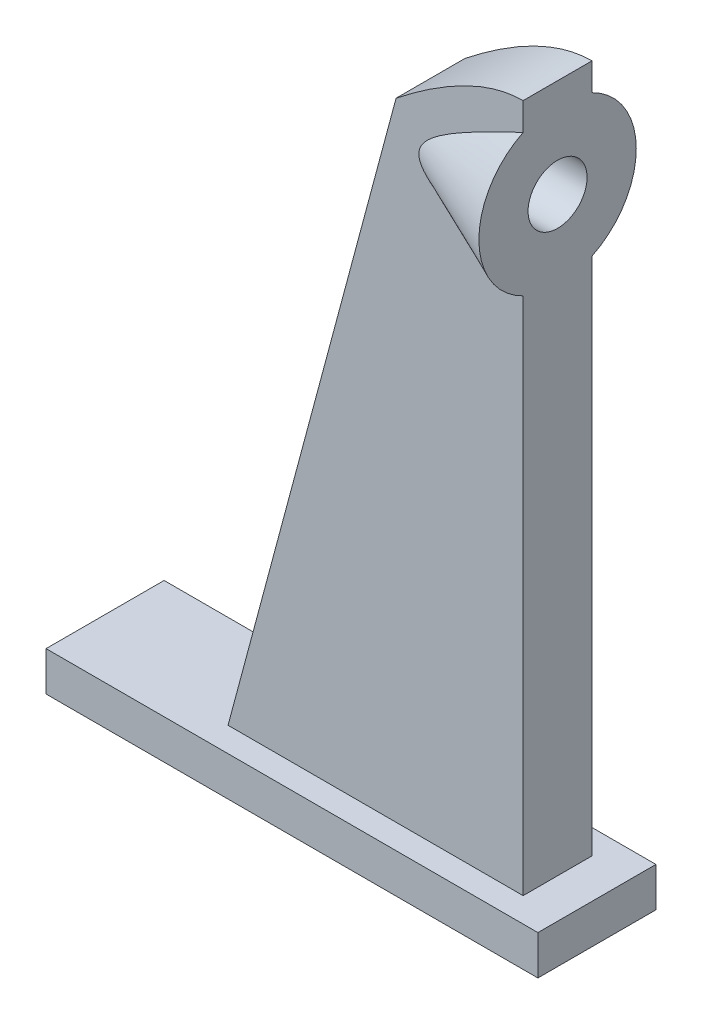
ISO-10303-21;
HEADER;
FILE_DESCRIPTION(('STEP AP214'),'2;1');
FILE_NAME('part.step','',(''),(''),'','','');
FILE_SCHEMA(('AUTOMOTIVE_DESIGN { 1 0 10303 214 1 1 1 1 }'));
ENDSEC;
DATA;
#1=APPLICATION_CONTEXT('core data for automotive mechanical design processes');
#2=APPLICATION_PROTOCOL_DEFINITION('international standard','automotive_design',2000,#1);
#3=PRODUCT_CONTEXT('',#1,'mechanical');
#4=PRODUCT('Part','Part','',(#3));
#5=PRODUCT_RELATED_PRODUCT_CATEGORY('part','',(#4));
#6=PRODUCT_DEFINITION_FORMATION('','',#4);
#7=PRODUCT_DEFINITION_CONTEXT('part definition',#1,'design');
#8=PRODUCT_DEFINITION('design','',#6,#7);
#9=PRODUCT_DEFINITION_SHAPE('','',#8);
#10=(LENGTH_UNIT() NAMED_UNIT(*) SI_UNIT(.MILLI.,.METRE.));
#11=(NAMED_UNIT(*) PLANE_ANGLE_UNIT() SI_UNIT($,.RADIAN.));
#12=(NAMED_UNIT(*) SI_UNIT($,.STERADIAN.) SOLID_ANGLE_UNIT());
#13=UNCERTAINTY_MEASURE_WITH_UNIT(LENGTH_MEASURE(1.E-05),#10,'distance_accuracy_value','');
#14=(GEOMETRIC_REPRESENTATION_CONTEXT(3) GLOBAL_UNCERTAINTY_ASSIGNED_CONTEXT((#13)) GLOBAL_UNIT_ASSIGNED_CONTEXT((#10,
#11,#12)) REPRESENTATION_CONTEXT('',''));
#15=CARTESIAN_POINT('',(0.,0.,0.));
#16=DIRECTION('',(0.,0.,1.));
#17=DIRECTION('',(1.,0.,0.));
#18=AXIS2_PLACEMENT_3D('',#15,#16,#17);
#19=CARTESIAN_POINT('',(125.,20.,30.));
#20=DIRECTION('',(-1.,0.,0.));
#21=DIRECTION('',(0.,0.,1.));
#22=AXIS2_PLACEMENT_3D('',#19,#20,#21);
#23=PLANE('',#22);
#24=DIRECTION('',(0.,0.,-1.));
#25=VECTOR('',#24,1.);
#26=CARTESIAN_POINT('',(125.,0.,30.));
#27=LINE('',#26,#25);
#28=CARTESIAN_POINT('',(125.,0.,30.));
#29=VERTEX_POINT('',#28);
#30=CARTESIAN_POINT('',(125.,0.,-30.));
#31=VERTEX_POINT('',#30);
#32=EDGE_CURVE('E169',#29,#31,#27,.T.);
#33=ORIENTED_EDGE('',*,*,#32,.T.);
#34=DIRECTION('',(0.,-1.,0.));
#35=VECTOR('',#34,1.);
#36=CARTESIAN_POINT('',(125.,20.,-30.));
#37=LINE('',#36,#35);
#38=CARTESIAN_POINT('',(125.,20.,-30.));
#39=VERTEX_POINT('',#38);
#40=EDGE_CURVE('E41',#39,#31,#37,.T.);
#41=ORIENTED_EDGE('',*,*,#40,.F.);
#42=DIRECTION('',(0.,0.,-1.));
#43=VECTOR('',#42,1.);
#44=CARTESIAN_POINT('',(125.,20.,30.));
#45=LINE('',#44,#43);
#46=CARTESIAN_POINT('',(125.,20.,30.));
#47=VERTEX_POINT('',#46);
#48=EDGE_CURVE('E164',#47,#39,#45,.T.);
#49=ORIENTED_EDGE('',*,*,#48,.F.);
#50=DIRECTION('',(0.,-1.,0.));
#51=VECTOR('',#50,1.);
#52=CARTESIAN_POINT('',(125.,20.,30.));
#53=LINE('',#52,#51);
#54=EDGE_CURVE('E158',#47,#29,#53,.T.);
#55=ORIENTED_EDGE('',*,*,#54,.T.);
#56=EDGE_LOOP('',(#33,#41,#49,#55));
#57=FACE_BOUND('',#56,.T.);
#58=ADVANCED_FACE('F33',(#57),#23,.F.);
#59=CARTESIAN_POINT('',(-125.,20.,-30.));
#60=DIRECTION('',(0.,0.,1.));
#61=DIRECTION('',(1.,0.,0.));
#62=AXIS2_PLACEMENT_3D('',#59,#60,#61);
#63=PLANE('',#62);
#64=DIRECTION('',(-1.,0.,0.));
#65=VECTOR('',#64,1.);
#66=CARTESIAN_POINT('',(-125.,0.,-30.));
#67=LINE('',#66,#65);
#68=CARTESIAN_POINT('',(-125.,0.,-30.));
#69=VERTEX_POINT('',#68);
#70=EDGE_CURVE('E167',#31,#69,#67,.T.);
#71=ORIENTED_EDGE('',*,*,#70,.T.);
#72=DIRECTION('',(0.,-1.,0.));
#73=VECTOR('',#72,1.);
#74=CARTESIAN_POINT('',(-125.,20.,-30.));
#75=LINE('',#74,#73);
#76=CARTESIAN_POINT('',(-125.,20.,-30.));
#77=VERTEX_POINT('',#76);
#78=EDGE_CURVE('E152',#77,#69,#75,.T.);
#79=ORIENTED_EDGE('',*,*,#78,.F.);
#80=DIRECTION('',(-1.,0.,0.));
#81=VECTOR('',#80,1.);
#82=CARTESIAN_POINT('',(-125.,20.,-30.));
#83=LINE('',#82,#81);
#84=EDGE_CURVE('E176',#39,#77,#83,.T.);
#85=ORIENTED_EDGE('',*,*,#84,.F.);
#86=ORIENTED_EDGE('',*,*,#40,.T.);
#87=EDGE_LOOP('',(#71,#79,#85,#86));
#88=FACE_BOUND('',#87,.T.);
#89=ADVANCED_FACE('F226',(#88),#63,.F.);
#90=CARTESIAN_POINT('',(-125.,20.,30.));
#91=DIRECTION('',(1.,0.,0.));
#92=DIRECTION('',(0.,0.,-1.));
#93=AXIS2_PLACEMENT_3D('',#90,#91,#92);
#94=PLANE('',#93);
#95=DIRECTION('',(0.,0.,1.));
#96=VECTOR('',#95,1.);
#97=CARTESIAN_POINT('',(-125.,0.,30.));
#98=LINE('',#97,#96);
#99=CARTESIAN_POINT('',(-125.,0.,30.));
#100=VERTEX_POINT('',#99);
#101=EDGE_CURVE('E165',#69,#100,#98,.T.);
#102=ORIENTED_EDGE('',*,*,#101,.T.);
#103=DIRECTION('',(0.,-1.,0.));
#104=VECTOR('',#103,1.);
#105=CARTESIAN_POINT('',(-125.,20.,30.));
#106=LINE('',#105,#104);
#107=CARTESIAN_POINT('',(-125.,20.,30.));
#108=VERTEX_POINT('',#107);
#109=EDGE_CURVE('E155',#108,#100,#106,.T.);
#110=ORIENTED_EDGE('',*,*,#109,.F.);
#111=DIRECTION('',(0.,0.,1.));
#112=VECTOR('',#111,1.);
#113=CARTESIAN_POINT('',(-125.,20.,30.));
#114=LINE('',#113,#112);
#115=EDGE_CURVE('E174',#77,#108,#114,.T.);
#116=ORIENTED_EDGE('',*,*,#115,.F.);
#117=ORIENTED_EDGE('',*,*,#78,.T.);
#118=EDGE_LOOP('',(#102,#110,#116,#117));
#119=FACE_BOUND('',#118,.T.);
#120=ADVANCED_FACE('F223',(#119),#94,.F.);
#121=CARTESIAN_POINT('',(-125.,20.,30.));
#122=DIRECTION('',(0.,0.,-1.));
#123=DIRECTION('',(-1.,0.,0.));
#124=AXIS2_PLACEMENT_3D('',#121,#122,#123);
#125=PLANE('',#124);
#126=DIRECTION('',(1.,0.,0.));
#127=VECTOR('',#126,1.);
#128=CARTESIAN_POINT('',(-125.,0.,30.));
#129=LINE('',#128,#127);
#130=EDGE_CURVE('E162',#100,#29,#129,.T.);
#131=ORIENTED_EDGE('',*,*,#130,.T.);
#132=ORIENTED_EDGE('',*,*,#54,.F.);
#133=DIRECTION('',(1.,0.,0.));
#134=VECTOR('',#133,1.);
#135=CARTESIAN_POINT('',(-125.,20.,30.));
#136=LINE('',#135,#134);
#137=EDGE_CURVE('E161',#108,#47,#136,.T.);
#138=ORIENTED_EDGE('',*,*,#137,.F.);
#139=ORIENTED_EDGE('',*,*,#109,.T.);
#140=EDGE_LOOP('',(#131,#132,#138,#139));
#141=FACE_BOUND('',#140,.T.);
#142=ADVANCED_FACE('F216',(#141),#125,.F.);
#143=CARTESIAN_POINT('',(0.,20.,0.));
#144=DIRECTION('',(0.,-1.,0.));
#145=DIRECTION('',(0.,0.,-1.));
#146=AXIS2_PLACEMENT_3D('',#143,#144,#145);
#147=PLANE('',#146);
#148=DIRECTION('',(1.,0.,0.));
#149=VECTOR('',#148,1.);
#150=CARTESIAN_POINT('',(105.,20.,-17.5));
#151=LINE('',#150,#149);
#152=CARTESIAN_POINT('',(-45.,20.,-17.5));
#153=VERTEX_POINT('',#152);
#154=CARTESIAN_POINT('',(105.,20.,-17.5));
#155=VERTEX_POINT('',#154);
#156=EDGE_CURVE('E182',#153,#155,#151,.T.);
#157=ORIENTED_EDGE('',*,*,#156,.T.);
#158=DIRECTION('',(0.,0.,1.));
#159=VECTOR('',#158,1.);
#160=CARTESIAN_POINT('',(105.,20.,-17.5));
#161=LINE('',#160,#159);
#162=CARTESIAN_POINT('',(105.,20.,17.5));
#163=VERTEX_POINT('',#162);
#164=EDGE_CURVE('E172',#155,#163,#161,.T.);
#165=ORIENTED_EDGE('',*,*,#164,.T.);
#166=DIRECTION('',(1.,0.,0.));
#167=VECTOR('',#166,1.);
#168=CARTESIAN_POINT('',(105.,20.,17.5));
#169=LINE('',#168,#167);
#170=CARTESIAN_POINT('',(-45.,20.,17.5));
#171=VERTEX_POINT('',#170);
#172=EDGE_CURVE('E350',#171,#163,#169,.T.);
#173=ORIENTED_EDGE('',*,*,#172,.F.);
#174=DIRECTION('',(0.,0.,1.));
#175=VECTOR('',#174,1.);
#176=CARTESIAN_POINT('',(-45.,20.,-17.5));
#177=LINE('',#176,#175);
#178=EDGE_CURVE('E184',#153,#171,#177,.T.);
#179=ORIENTED_EDGE('',*,*,#178,.F.);
#180=EDGE_LOOP('',(#157,#165,#173,#179));
#181=FACE_BOUND('',#180,.T.);
#182=ORIENTED_EDGE('',*,*,#48,.T.);
#183=ORIENTED_EDGE('',*,*,#84,.T.);
#184=ORIENTED_EDGE('',*,*,#115,.T.);
#185=ORIENTED_EDGE('',*,*,#137,.T.);
#186=EDGE_LOOP('',(#182,#183,#184,#185));
#187=FACE_BOUND('',#186,.T.);
#188=ADVANCED_FACE('F213',(#181,#187),#147,.F.);
#189=CARTESIAN_POINT('',(0.,0.,0.));
#190=DIRECTION('',(0.,-1.,0.));
#191=DIRECTION('',(0.,0.,-1.));
#192=AXIS2_PLACEMENT_3D('',#189,#190,#191);
#193=PLANE('',#192);
#194=ORIENTED_EDGE('',*,*,#32,.F.);
#195=ORIENTED_EDGE('',*,*,#130,.F.);
#196=ORIENTED_EDGE('',*,*,#101,.F.);
#197=ORIENTED_EDGE('',*,*,#70,.F.);
#198=EDGE_LOOP('',(#194,#195,#196,#197));
#199=FACE_BOUND('',#198,.T.);
#200=ADVANCED_FACE('F211',(#199),#193,.T.);
#201=CARTESIAN_POINT('',(105.,20.,-17.5));
#202=DIRECTION('',(1.,0.,0.));
#203=DIRECTION('',(0.,1.,0.));
#204=AXIS2_PLACEMENT_3D('',#201,#202,#203);
#205=PLANE('',#204);
#206=CARTESIAN_POINT('',(105.,320.,0.));
#207=DIRECTION('',(1.,0.,0.));
#208=DIRECTION('',(0.,1.,0.));
#209=AXIS2_PLACEMENT_3D('',#206,#207,#208);
#210=CIRCLE('',#209,15.);
#211=CARTESIAN_POINT('',(105.,335.,0.));
#212=VERTEX_POINT('',#211);
#213=EDGE_CURVE('E126',#212,#212,#210,.T.);
#214=ORIENTED_EDGE('',*,*,#213,.F.);
#215=EDGE_LOOP('',(#214));
#216=FACE_BOUND('',#215,.T.);
#217=DIRECTION('',(0.,1.,0.));
#218=VECTOR('',#217,1.);
#219=CARTESIAN_POINT('',(105.,20.,17.5));
#220=LINE('',#219,#218);
#221=CARTESIAN_POINT('',(105.,355.968736424845,17.5));
#222=VERTEX_POINT('',#221);
#223=CARTESIAN_POINT('',(105.,370.,17.5));
#224=VERTEX_POINT('',#223);
#225=EDGE_CURVE('E109',#222,#224,#220,.T.);
#226=ORIENTED_EDGE('',*,*,#225,.F.);
#227=CARTESIAN_POINT('',(105.,320.,0.));
#228=DIRECTION('',(1.,0.,0.));
#229=DIRECTION('',(0.,1.,0.));
#230=AXIS2_PLACEMENT_3D('',#227,#228,#229);
#231=CIRCLE('',#230,40.);
#232=CARTESIAN_POINT('',(105.,284.031263575155,17.5));
#233=VERTEX_POINT('',#232);
#234=EDGE_CURVE('E112',#222,#233,#231,.T.);
#235=ORIENTED_EDGE('',*,*,#234,.T.);
#236=EDGE_CURVE('E56',#163,#233,#220,.T.);
#237=ORIENTED_EDGE('',*,*,#236,.F.);
#238=ORIENTED_EDGE('',*,*,#164,.F.);
#239=DIRECTION('',(0.,1.,0.));
#240=VECTOR('',#239,1.);
#241=CARTESIAN_POINT('',(105.,20.,-17.5));
#242=LINE('',#241,#240);
#243=CARTESIAN_POINT('',(105.,284.031263575155,-17.5));
#244=VERTEX_POINT('',#243);
#245=EDGE_CURVE('E198',#155,#244,#242,.T.);
#246=ORIENTED_EDGE('',*,*,#245,.T.);
#247=CARTESIAN_POINT('',(105.,355.968736424845,-17.5));
#248=VERTEX_POINT('',#247);
#249=EDGE_CURVE('E48',#244,#248,#231,.T.);
#250=ORIENTED_EDGE('',*,*,#249,.T.);
#251=CARTESIAN_POINT('',(105.,370.,-17.5));
#252=VERTEX_POINT('',#251);
#253=EDGE_CURVE('E354',#248,#252,#242,.T.);
#254=ORIENTED_EDGE('',*,*,#253,.T.);
#255=DIRECTION('',(0.,0.,1.));
#256=VECTOR('',#255,1.);
#257=CARTESIAN_POINT('',(105.,370.,-17.5));
#258=LINE('',#257,#256);
#259=EDGE_CURVE('E114',#252,#224,#258,.T.);
#260=ORIENTED_EDGE('',*,*,#259,.T.);
#261=EDGE_LOOP('',(#226,#235,#237,#238,#246,#250,#254,#260));
#262=FACE_BOUND('',#261,.T.);
#263=ADVANCED_FACE('F110',(#216,#262),#205,.T.);
#264=CARTESIAN_POINT('',(-45.,20.,-17.5));
#265=DIRECTION('',(-0.965925826289067,0.258819045102525,0.));
#266=DIRECTION('',(-0.258819045102525,-0.965925826289067,0.));
#267=AXIS2_PLACEMENT_3D('',#264,#265,#266);
#268=PLANE('',#267);
#269=CARTESIAN_POINT('',(35.3847577293381,320.,0.));
#270=DIRECTION('',(-0.965925826289067,0.258819045102525,0.));
#271=DIRECTION('',(0.258819045102525,0.965925826289067,0.));
#272=AXIS2_PLACEMENT_3D('',#269,#270,#271);
#273=ELLIPSE('',#272,15.5291427061513,15.);
#274=CARTESIAN_POINT('',(39.403995615805,335.,0.));
#275=VERTEX_POINT('',#274);
#276=EDGE_CURVE('E36',#275,#275,#273,.T.);
#277=ORIENTED_EDGE('',*,*,#276,.F.);
#278=EDGE_LOOP('',(#277));
#279=FACE_BOUND('',#278,.T.);
#280=ORIENTED_EDGE('',*,*,#178,.T.);
#281=DIRECTION('',(-0.258819045102525,-0.965925826289067,0.));
#282=VECTOR('',#281,1.);
#283=CARTESIAN_POINT('',(-45.,20.,17.5));
#284=LINE('',#283,#282);
#285=CARTESIAN_POINT('',(40.4102848838331,338.755522675392,17.5));
#286=VERTEX_POINT('',#285);
#287=EDGE_CURVE('E346',#286,#171,#284,.T.);
#288=ORIENTED_EDGE('',*,*,#287,.F.);
#289=DIRECTION('',(0.,0.,1.));
#290=VECTOR('',#289,1.);
#291=CARTESIAN_POINT('',(40.4102848838331,338.755522675392,-17.5));
#292=LINE('',#291,#290);
#293=CARTESIAN_POINT('',(40.4102848838331,338.755522675392,-17.5));
#294=VERTEX_POINT('',#293);
#295=EDGE_CURVE('E181',#294,#286,#292,.T.);
#296=ORIENTED_EDGE('',*,*,#295,.F.);
#297=DIRECTION('',(-0.258819045102525,-0.965925826289067,0.));
#298=VECTOR('',#297,1.);
#299=CARTESIAN_POINT('',(-45.,20.,-17.5));
#300=LINE('',#299,#298);
#301=EDGE_CURVE('E190',#294,#153,#300,.T.);
#302=ORIENTED_EDGE('',*,*,#301,.T.);
#303=EDGE_LOOP('',(#280,#288,#296,#302));
#304=FACE_BOUND('',#303,.T.);
#305=ADVANCED_FACE('F207',(#279,#304),#268,.T.);
#306=CARTESIAN_POINT('',(105.,370.,-17.5));
#307=CARTESIAN_POINT('',(80.,370.,-17.5));
#308=CARTESIAN_POINT('',(40.4102848838331,338.755522675392,-17.5));
#309=B_SPLINE_CURVE_WITH_KNOTS('',2,(#306,#307,#308),.UNSPECIFIED.,.F.,.F.,(3,3),(0.,1.),.UNSPECIFIED.);
#310=DIRECTION('',(0.,0.,1.));
#311=VECTOR('',#310,1.);
#312=SURFACE_OF_LINEAR_EXTRUSION('',#309,#311);
#313=ORIENTED_EDGE('',*,*,#295,.T.);
#314=CARTESIAN_POINT('',(105.,370.,17.5));
#315=CARTESIAN_POINT('',(80.,370.,17.5));
#316=CARTESIAN_POINT('',(40.4102848838331,338.755522675392,17.5));
#317=B_SPLINE_CURVE_WITH_KNOTS('',2,(#314,#315,#316),.UNSPECIFIED.,.F.,.F.,(3,3),(0.,1.),.UNSPECIFIED.);
#318=EDGE_CURVE('E351',#224,#286,#317,.T.);
#319=ORIENTED_EDGE('',*,*,#318,.F.);
#320=ORIENTED_EDGE('',*,*,#259,.F.);
#321=EDGE_CURVE('E192',#252,#294,#309,.T.);
#322=ORIENTED_EDGE('',*,*,#321,.T.);
#323=EDGE_LOOP('',(#313,#319,#320,#322));
#324=FACE_BOUND('',#323,.T.);
#325=ADVANCED_FACE('F204',(#324),#312,.T.);
#326=CARTESIAN_POINT('',(76.3525712209583,362.188880668848,-17.5));
#327=DIRECTION('',(0.,0.,1.));
#328=DIRECTION('',(1.,0.,0.));
#329=AXIS2_PLACEMENT_3D('',#326,#327,#328);
#330=PLANE('',#329);
#331=ORIENTED_EDGE('',*,*,#253,.F.);
#332=CARTESIAN_POINT('',(218.137284989848,406.266806739352,-17.5));
#333=CARTESIAN_POINT('',(215.77531891875,405.243787461237,-17.5));
#334=CARTESIAN_POINT('',(213.413612892099,404.220167850385,-17.5));
#335=CARTESIAN_POINT('',(208.690786551047,402.171577490282,-17.5));
#336=CARTESIAN_POINT('',(206.329666236725,401.146606740849,-17.5));
#337=CARTESIAN_POINT('',(199.247250114454,398.06942809133,-17.5));
#338=CARTESIAN_POINT('',(194.526932286778,396.01496814714,-17.5));
#339=CARTESIAN_POINT('',(185.084020425572,391.896004149664,-17.5));
#340=CARTESIAN_POINT('',(180.361430324995,389.83149107795,-17.5));
#341=CARTESIAN_POINT('',(170.920591293877,385.692623771745,-17.5));
#342=CARTESIAN_POINT('',(166.202342340145,383.618269590196,-17.5));
#343=CARTESIAN_POINT('',(159.01608149934,380.446920831363,-17.5));
#344=CARTESIAN_POINT('',(156.545968047058,379.354688296369,-17.5));
#345=CARTESIAN_POINT('',(151.607627891349,377.16596695099,-17.5));
#346=CARTESIAN_POINT('',(149.139401187339,376.069478141925,-17.5));
#347=CARTESIAN_POINT('',(144.205150708024,373.871438716567,-17.5));
#348=CARTESIAN_POINT('',(141.739126971641,372.769888012875,-17.5));
#349=CARTESIAN_POINT('',(136.809790101517,370.560738917928,-17.5));
#350=CARTESIAN_POINT('',(134.346476966499,369.453140529521,-17.5));
#351=CARTESIAN_POINT('',(129.425772166185,367.231778377236,-17.5));
#352=CARTESIAN_POINT('',(126.968376992194,366.118022389692,-17.5));
#353=CARTESIAN_POINT('',(122.057687016696,363.881485947814,-17.5));
#354=CARTESIAN_POINT('',(119.604392224346,362.758705473361,-17.5));
#355=CARTESIAN_POINT('',(114.703097598468,360.501886530877,-17.5));
#356=CARTESIAN_POINT('',(112.255097563291,359.367848501122,-17.5));
#357=CARTESIAN_POINT('',(107.365832705222,357.085356714139,-17.5));
#358=CARTESIAN_POINT('',(104.924567842467,355.936903042456,-17.5));
#359=CARTESIAN_POINT('',(100.630986445417,353.896655347703,-17.5));
#360=CARTESIAN_POINT('',(98.7767849393798,353.008830210211,-17.5));
#361=CARTESIAN_POINT('',(95.0749286703318,351.219342638487,-17.5));
#362=CARTESIAN_POINT('',(93.2272742743602,350.317679443122,-17.5));
#363=CARTESIAN_POINT('',(90.4602003232931,348.950866678503,-17.5));
#364=CARTESIAN_POINT('',(89.5375100763668,348.492336302878,-17.5));
#365=CARTESIAN_POINT('',(87.6946805310852,347.570180214336,-17.5));
#366=CARTESIAN_POINT('',(86.7745412251965,347.106554516487,-17.5));
#367=CARTESIAN_POINT('',(84.9373858009734,346.173520147769,-17.5));
#368=CARTESIAN_POINT('',(84.0203691980752,345.7041124317,-17.5));
#369=CARTESIAN_POINT('',(82.1898459628947,344.758501424961,-17.5));
#370=CARTESIAN_POINT('',(81.2763393217536,344.282298151457,-17.5));
#371=CARTESIAN_POINT('',(79.4655573338352,343.328278945671,-17.5));
#372=CARTESIAN_POINT('',(78.5682270143412,342.850567473535,-17.5));
#373=CARTESIAN_POINT('',(76.7784797270659,341.885991022634,-17.5));
#374=CARTESIAN_POINT('',(75.8860628152164,341.399125939946,-17.5));
#375=CARTESIAN_POINT('',(74.1066528274325,340.414131274901,-17.5));
#376=CARTESIAN_POINT('',(73.2196639047566,339.915994174234,-17.5));
#377=CARTESIAN_POINT('',(71.4532745107086,338.906487075549,-17.5));
#378=CARTESIAN_POINT('',(70.5738737868599,338.395117520086,-17.5));
#379=CARTESIAN_POINT('',(68.8279548907131,337.358015200117,-17.5));
#380=CARTESIAN_POINT('',(67.9614009790299,336.832342902584,-17.5));
#381=CARTESIAN_POINT('',(66.6709757175746,336.028572125292,-17.5));
#382=CARTESIAN_POINT('',(66.2423629542073,335.758079478604,-17.5));
#383=CARTESIAN_POINT('',(65.3888234083654,335.21134555515,-17.5));
#384=CARTESIAN_POINT('',(64.9638965628197,334.935104377024,-17.5));
#385=CARTESIAN_POINT('',(64.1188499941139,334.376424148302,-17.5));
#386=CARTESIAN_POINT('',(63.6987251987898,334.093992780404,-17.5));
#387=CARTESIAN_POINT('',(62.8635816381736,333.521693035302,-17.5));
#388=CARTESIAN_POINT('',(62.4485627031184,333.231824906354,-17.5));
#389=CARTESIAN_POINT('',(61.6247578638352,332.643603478139,-17.5));
#390=CARTESIAN_POINT('',(61.2159701430989,332.345252727292,-17.5));
#391=CARTESIAN_POINT('',(60.4058423472537,331.738630647548,-17.5));
#392=CARTESIAN_POINT('',(60.0045016343431,331.43036017447,-17.5));
#393=CARTESIAN_POINT('',(59.4176883559897,330.965798948091,-17.5));
#394=CARTESIAN_POINT('',(59.2286653275615,330.813984363857,-17.5));
#395=CARTESIAN_POINT('',(58.8529696834506,330.507454170058,-17.5));
#396=CARTESIAN_POINT('',(58.6662971667051,330.352738439055,-17.5));
#397=CARTESIAN_POINT('',(58.2955470717255,330.04013725335,-17.5));
#398=CARTESIAN_POINT('',(58.1114701033723,329.882251074133,-17.5));
#399=CARTESIAN_POINT('',(57.746290796914,329.563076104937,-17.5));
#400=CARTESIAN_POINT('',(57.5651884839244,329.401787286255,-17.5));
#401=CARTESIAN_POINT('',(57.0266470803546,328.912151742227,-17.5));
#402=CARTESIAN_POINT('',(56.6742188775535,328.578241237607,-17.5));
#403=CARTESIAN_POINT('',(55.9867662883865,327.892951346214,-17.5));
#404=CARTESIAN_POINT('',(55.651738312745,327.541575591631,-17.5));
#405=CARTESIAN_POINT('',(55.0821100132244,326.904543716155,-17.5));
#406=CARTESIAN_POINT('',(54.8426454012097,326.623252885749,-17.5));
#407=CARTESIAN_POINT('',(54.3806405089528,326.047127450251,-17.5));
#408=CARTESIAN_POINT('',(54.1580950956696,325.75229699678,-17.5));
#409=CARTESIAN_POINT('',(53.7347874719742,325.147992113835,-17.5));
#410=CARTESIAN_POINT('',(53.5339903014745,324.838542370542,-17.5));
#411=CARTESIAN_POINT('',(53.1597948707136,324.203492978277,-17.5));
#412=CARTESIAN_POINT('',(52.9863784058108,323.877904250503,-17.5));
#413=CARTESIAN_POINT('',(52.7325898968047,323.335183471271,-17.5));
#414=CARTESIAN_POINT('',(52.6416611286799,323.122975688766,-17.5));
#415=CARTESIAN_POINT('',(52.4754559338443,322.692545886516,-17.5));
#416=CARTESIAN_POINT('',(52.4001738725062,322.474326063975,-17.5));
#417=CARTESIAN_POINT('',(52.2673606061829,322.032891186534,-17.5));
#418=CARTESIAN_POINT('',(52.2098011404105,321.809684699603,-17.5));
#419=CARTESIAN_POINT('',(52.114092445955,321.359113775464,-17.5));
#420=CARTESIAN_POINT('',(52.0759428857641,321.131749409339,-17.5));
#421=CARTESIAN_POINT('',(52.0202060256523,320.672668133486,-17.5));
#422=CARTESIAN_POINT('',(52.0027831512301,320.440931042825,-17.5));
#423=CARTESIAN_POINT('',(51.9897342579832,319.976846346654,-17.5));
#424=CARTESIAN_POINT('',(51.9941075128519,319.744498761745,-17.5));
#425=CARTESIAN_POINT('',(52.024487487381,319.281044793087,-17.5));
#426=CARTESIAN_POINT('',(52.0505117885889,319.049939571742,-17.5));
#427=CARTESIAN_POINT('',(52.1232134433659,318.591012118103,-17.5));
#428=CARTESIAN_POINT('',(52.1698934788905,318.363190316099,-17.5));
#429=CARTESIAN_POINT('',(52.2926045766029,317.870954837914,-17.5));
#430=CARTESIAN_POINT('',(52.3724485576779,317.60749331694,-17.5));
#431=CARTESIAN_POINT('',(52.5554953163052,317.088854454016,-17.5));
#432=CARTESIAN_POINT('',(52.6587039404186,316.833679203855,-17.5));
#433=CARTESIAN_POINT('',(52.8852169218319,316.331944099257,-17.5));
#434=CARTESIAN_POINT('',(53.0085563517592,316.085400209841,-17.5));
#435=CARTESIAN_POINT('',(53.2719889865955,315.601516923066,-17.5));
#436=CARTESIAN_POINT('',(53.4120825234007,315.364177708174,-17.5));
#437=CARTESIAN_POINT('',(53.8313195272822,314.700197810449,-17.5));
#438=CARTESIAN_POINT('',(54.1273879932194,314.284236197092,-17.5));
#439=CARTESIAN_POINT('',(54.7536357012697,313.478768441096,-17.5));
#440=CARTESIAN_POINT('',(55.0838480234871,313.089288572167,-17.5));
#441=CARTESIAN_POINT('',(55.5982345025286,312.521444366261,-17.5));
#442=CARTESIAN_POINT('',(55.7731813180082,312.334595441934,-17.5));
#443=CARTESIAN_POINT('',(56.1284748844592,311.966092772631,-17.5));
#444=CARTESIAN_POINT('',(56.3088216993681,311.784439089217,-17.5));
#445=CARTESIAN_POINT('',(56.6740675685319,311.425983853329,-17.5));
#446=CARTESIAN_POINT('',(56.858964080221,311.249179702532,-17.5));
#447=CARTESIAN_POINT('',(57.2328037279597,310.899919610963,-17.5));
#448=CARTESIAN_POINT('',(57.4217467884472,310.727463589129,-17.5));
#449=CARTESIAN_POINT('',(58.0067961080155,310.20449476356,-17.5));
#450=CARTESIAN_POINT('',(58.4087056407445,309.860460878029,-17.5));
#451=CARTESIAN_POINT('',(59.2242406788103,309.186519666755,-17.5));
#452=CARTESIAN_POINT('',(59.6378684001983,308.856615043058,-17.5));
#453=CARTESIAN_POINT('',(60.4746546878632,308.208553030884,-17.5));
#454=CARTESIAN_POINT('',(60.8978195862438,307.890403840741,-17.5));
#455=CARTESIAN_POINT('',(61.7515840310747,307.264333706491,-17.5));
#456=CARTESIAN_POINT('',(62.1821831021468,306.956412112035,-17.5));
#457=CARTESIAN_POINT('',(63.0506292121239,306.348548333473,-17.5));
#458=CARTESIAN_POINT('',(63.4884921566121,306.048628923321,-17.5));
#459=CARTESIAN_POINT('',(64.3693441599068,305.456416616102,-17.5));
#460=CARTESIAN_POINT('',(64.8123332882111,305.164123822609,-17.5));
#461=CARTESIAN_POINT('',(65.7024615011639,304.586300433795,-17.5));
#462=CARTESIAN_POINT('',(66.1495989937648,304.300767382445,-17.5));
#463=CARTESIAN_POINT('',(67.0475569236254,303.735546528732,-17.5));
#464=CARTESIAN_POINT('',(67.4983774200536,303.455858820536,-17.5));
#465=CARTESIAN_POINT('',(68.8600852388693,302.621753453715,-17.5));
#466=CARTESIAN_POINT('',(69.775769508022,302.075160606814,-17.5));
#467=CARTESIAN_POINT('',(71.6168166223736,300.998443208279,-17.5));
#468=CARTESIAN_POINT('',(72.5421802122431,300.468319936361,-17.5));
#469=CARTESIAN_POINT('',(74.3989008467952,299.42232349606,-17.5));
#470=CARTESIAN_POINT('',(75.3302454481367,298.906428210158,-17.5));
#471=CARTESIAN_POINT('',(76.7317411954011,298.140848356751,-17.5));
#472=CARTESIAN_POINT('',(77.1996458233768,297.887036019661,-17.5));
#473=CARTESIAN_POINT('',(78.1368124534571,297.381928988933,-17.5));
#474=CARTESIAN_POINT('',(78.6060744556007,297.130634295368,-17.5));
#475=CARTESIAN_POINT('',(80.0026324547129,296.387151890463,-17.5));
#476=CARTESIAN_POINT('',(80.9316967932966,295.898284148043,-17.5));
#477=CARTESIAN_POINT('',(82.7937712760071,294.928114352928,-17.5));
#478=CARTESIAN_POINT('',(83.7267814556398,294.446812368496,-17.5));
#479=CARTESIAN_POINT('',(85.5961429671902,293.4906742535,-17.5));
#480=CARTESIAN_POINT('',(86.5324944005161,293.015838321325,-17.5));
#481=CARTESIAN_POINT('',(88.4080185404379,292.071768337065,-17.5));
#482=CARTESIAN_POINT('',(89.3471912573227,291.60253430544,-17.5));
#483=CARTESIAN_POINT('',(92.1685790965401,290.20198815067,-17.5));
#484=CARTESIAN_POINT('',(94.0544113821348,289.277960588942,-17.5));
#485=CARTESIAN_POINT('',(97.8332992615528,287.444911849717,-17.5));
#486=CARTESIAN_POINT('',(99.7263547405698,286.535890434926,-17.5));
#487=CARTESIAN_POINT('',(103.519988846798,284.728840846647,-17.5));
#488=CARTESIAN_POINT('',(105.420573048345,283.830824385897,-17.5));
#489=CARTESIAN_POINT('',(109.226249829971,282.044388386064,-17.5));
#490=CARTESIAN_POINT('',(111.131342425692,281.155968880336,-17.5));
#491=CARTESIAN_POINT('',(114.945026046972,279.387065852804,-17.5));
#492=CARTESIAN_POINT('',(116.853616789064,278.506581719455,-17.5));
#493=CARTESIAN_POINT('',(120.6737947499,276.752147803758,-17.5));
#494=CARTESIAN_POINT('',(122.585381965045,275.878198013568,-17.5));
#495=CARTESIAN_POINT('',(126.402705559596,274.139589985413,-17.5));
#496=CARTESIAN_POINT('',(128.308431055333,273.274907841283,-17.5));
#497=CARTESIAN_POINT('',(132.121974719217,271.550171564231,-17.5));
#498=CARTESIAN_POINT('',(134.029792887792,270.690117432255,-17.5));
#499=CARTESIAN_POINT('',(139.755976585896,268.115843025897,-17.5));
#500=CARTESIAN_POINT('',(143.577003215715,266.40754169176,-17.5));
#501=CARTESIAN_POINT('',(151.222903436829,263.003405626014,-17.5));
#502=CARTESIAN_POINT('',(155.047775078606,261.307566510521,-17.5));
#503=CARTESIAN_POINT('',(162.701564369807,257.925040297148,-17.5));
#504=CARTESIAN_POINT('',(166.530482021786,256.238353205053,-17.5));
#505=CARTESIAN_POINT('',(174.332482870827,252.810245545495,-17.5));
#506=CARTESIAN_POINT('',(178.305684907752,251.069095559636,-17.5));
#507=CARTESIAN_POINT('',(186.255157351932,247.592826216508,-17.5));
#508=CARTESIAN_POINT('',(190.231428006076,245.857707423985,-17.5));
#509=CARTESIAN_POINT('',(198.195118588144,242.388569565028,-17.5));
#510=CARTESIAN_POINT('',(202.18254343838,240.654561801424,-17.5));
#511=CARTESIAN_POINT('',(210.158834841745,237.19088109936,-17.5));
#512=CARTESIAN_POINT('',(214.147701226309,235.461207772758,-17.5));
#513=CARTESIAN_POINT('',(218.137284989848,233.733193260648,-17.5));
#514=B_SPLINE_CURVE_WITH_KNOTS('',3,(#332,#333,#334,#335,#336,#337,#338,#339,#340,#341,#342,
#343,#344,#345,#346,#347,#348,#349,#350,#351,#352,#353,#354,#355,#356,#357,#358,#359,#360,#361,
#362,#363,#364,#365,#366,#367,#368,#369,#370,#371,#372,#373,#374,#375,#376,#377,#378,#379,#380,
#381,#382,#383,#384,#385,#386,#387,#388,#389,#390,#391,#392,#393,#394,#395,#396,#397,#398,#399,
#400,#401,#402,#403,#404,#405,#406,#407,#408,#409,#410,#411,#412,#413,#414,#415,#416,#417,#418,
#419,#420,#421,#422,#423,#424,#425,#426,#427,#428,#429,#430,#431,#432,#433,#434,#435,#436,#437,
#438,#439,#440,#441,#442,#443,#444,#445,#446,#447,#448,#449,#450,#451,#452,#453,#454,#455,#456,
#457,#458,#459,#460,#461,#462,#463,#464,#465,#466,#467,#468,#469,#470,#471,#472,#473,#474,#475,
#476,#477,#478,#479,#480,#481,#482,#483,#484,#485,#486,#487,#488,#489,#490,#491,#492,#493,#494,
#495,#496,#497,#498,#499,#500,#501,#502,#503,#504,#505,#506,#507,#508,#509,#510,#511,#512,#513),
.UNSPECIFIED.,.F.,.F.,(4,2,2,2,2,2,2,2,2,2,2,2,2,2,2,2,2,2,2,2,2,2,2,2,2,2,2,2,2,2,2,2,2,2,2,2,
2,2,2,2,2,2,2,2,2,2,2,2,2,2,2,2,2,2,2,2,2,2,2,2,2,2,2,2,2,2,2,2,2,2,2,2,2,2,2,2,2,2,2,2,2,2,2,2,
2,2,2,2,2,2,4),(0.,7.72198592502717,15.443972894601,30.8880552364388,46.350442051366,
61.8127457794625,69.9152046855805,78.0176610806335,86.1202579025671,94.2228509089195,
102.316858459743,110.410884060098,118.504595772893,126.598259478286,132.765606880911,
138.933294729191,142.024312243962,145.115320620849,148.205825238489,151.296322050838,
154.345980882493,157.39567435847,160.447465674819,163.499155056628,166.539498990786,
168.059947955243,169.580370851232,171.099003073404,172.6175846659,174.135714756023,
175.653714219569,176.381012184594,177.108340661269,177.835837283512,178.56334004496,
180.019304666194,181.474967752014,182.582708161824,183.69011114682,184.795706711667,
185.900564074057,186.592654934041,187.284496127639,187.975228315218,188.665948705169,
189.36211282081,190.058253738517,190.754960503912,191.451757756772,192.276350459619,
193.101149729751,193.927401642926,194.753669926738,196.282681650068,197.813188881381,
198.580998499296,199.348817211899,200.116216165406,200.88360080159,202.470294421353,
204.057290133869,205.645372506398,207.233353702382,208.825454687001,210.41757728172,
212.009112242392,213.60067282199,216.799669174615,219.998913476517,223.192866710676,
224.789795127414,226.386723590071,229.536181015204,232.685666840703,235.835249081234,
238.984842821819,245.284880440936,251.584818340297,257.890962880326,264.197129330544,
270.502805561628,276.808474223452,283.086618254068,289.364763567271,301.921278580423,
314.473141959047,327.025013272952,340.038900918166,353.0539759869,366.098399793901,
379.141610465791),.UNSPECIFIED.);
#515=EDGE_CURVE('E117',#248,#244,#514,.T.);
#516=ORIENTED_EDGE('',*,*,#515,.T.);
#517=ORIENTED_EDGE('',*,*,#245,.F.);
#518=ORIENTED_EDGE('',*,*,#156,.F.);
#519=ORIENTED_EDGE('',*,*,#301,.F.);
#520=ORIENTED_EDGE('',*,*,#321,.F.);
#521=EDGE_LOOP('',(#331,#516,#517,#518,#519,#520));
#522=FACE_BOUND('',#521,.T.);
#523=ADVANCED_FACE('F134',(#522),#330,.F.);
#524=CARTESIAN_POINT('',(76.3525712209583,362.188880668848,17.5));
#525=DIRECTION('',(0.,0.,1.));
#526=DIRECTION('',(1.,0.,0.));
#527=AXIS2_PLACEMENT_3D('',#524,#525,#526);
#528=PLANE('',#527);
#529=CARTESIAN_POINT('',(218.137284989848,406.266806739352,17.5));
#530=CARTESIAN_POINT('',(215.77531891875,405.243787461237,17.5));
#531=CARTESIAN_POINT('',(213.413612892099,404.220167850385,17.5));
#532=CARTESIAN_POINT('',(208.690786551047,402.171577490282,17.5));
#533=CARTESIAN_POINT('',(206.329666236725,401.146606740849,17.5));
#534=CARTESIAN_POINT('',(199.247250114454,398.06942809133,17.5));
#535=CARTESIAN_POINT('',(194.526932286778,396.01496814714,17.5));
#536=CARTESIAN_POINT('',(185.084020425572,391.896004149664,17.5));
#537=CARTESIAN_POINT('',(180.361430324995,389.83149107795,17.5));
#538=CARTESIAN_POINT('',(170.920591293877,385.692623771745,17.5));
#539=CARTESIAN_POINT('',(166.202342340145,383.618269590196,17.5));
#540=CARTESIAN_POINT('',(159.01608149934,380.446920831363,17.5));
#541=CARTESIAN_POINT('',(156.545968047058,379.354688296369,17.5));
#542=CARTESIAN_POINT('',(151.607627891349,377.16596695099,17.5));
#543=CARTESIAN_POINT('',(149.139401187339,376.069478141925,17.5));
#544=CARTESIAN_POINT('',(144.205150708024,373.871438716567,17.5));
#545=CARTESIAN_POINT('',(141.739126971641,372.769888012875,17.5));
#546=CARTESIAN_POINT('',(136.809790101517,370.560738917928,17.5));
#547=CARTESIAN_POINT('',(134.346476966499,369.453140529521,17.5));
#548=CARTESIAN_POINT('',(129.425772166185,367.231778377236,17.5));
#549=CARTESIAN_POINT('',(126.968376992194,366.118022389692,17.5));
#550=CARTESIAN_POINT('',(122.057687016696,363.881485947814,17.5));
#551=CARTESIAN_POINT('',(119.604392224346,362.758705473361,17.5));
#552=CARTESIAN_POINT('',(114.703097598468,360.501886530877,17.5));
#553=CARTESIAN_POINT('',(112.255097563291,359.367848501122,17.5));
#554=CARTESIAN_POINT('',(107.365832705222,357.085356714139,17.5));
#555=CARTESIAN_POINT('',(104.924567842467,355.936903042456,17.5));
#556=CARTESIAN_POINT('',(100.630986445417,353.896655347703,17.5));
#557=CARTESIAN_POINT('',(98.7767849393798,353.008830210211,17.5));
#558=CARTESIAN_POINT('',(95.0749286703318,351.219342638487,17.5));
#559=CARTESIAN_POINT('',(93.2272742743602,350.317679443122,17.5));
#560=CARTESIAN_POINT('',(90.4602003232931,348.950866678503,17.5));
#561=CARTESIAN_POINT('',(89.5375100763668,348.492336302878,17.5));
#562=CARTESIAN_POINT('',(87.6946805310852,347.570180214336,17.5));
#563=CARTESIAN_POINT('',(86.7745412251965,347.106554516487,17.5));
#564=CARTESIAN_POINT('',(84.9373858009734,346.173520147769,17.5));
#565=CARTESIAN_POINT('',(84.0203691980752,345.7041124317,17.5));
#566=CARTESIAN_POINT('',(82.1898459628947,344.758501424961,17.5));
#567=CARTESIAN_POINT('',(81.2763393217536,344.282298151457,17.5));
#568=CARTESIAN_POINT('',(79.4655573338352,343.328278945671,17.5));
#569=CARTESIAN_POINT('',(78.5682270143412,342.850567473535,17.5));
#570=CARTESIAN_POINT('',(76.7784797270659,341.885991022634,17.5));
#571=CARTESIAN_POINT('',(75.8860628152164,341.399125939946,17.5));
#572=CARTESIAN_POINT('',(74.1066528274325,340.414131274901,17.5));
#573=CARTESIAN_POINT('',(73.2196639047566,339.915994174234,17.5));
#574=CARTESIAN_POINT('',(71.4532745107086,338.906487075549,17.5));
#575=CARTESIAN_POINT('',(70.5738737868599,338.395117520086,17.5));
#576=CARTESIAN_POINT('',(68.8279548907131,337.358015200117,17.5));
#577=CARTESIAN_POINT('',(67.9614009790299,336.832342902584,17.5));
#578=CARTESIAN_POINT('',(66.6709757175746,336.028572125292,17.5));
#579=CARTESIAN_POINT('',(66.2423629542073,335.758079478604,17.5));
#580=CARTESIAN_POINT('',(65.3888234083654,335.21134555515,17.5));
#581=CARTESIAN_POINT('',(64.9638965628197,334.935104377024,17.5));
#582=CARTESIAN_POINT('',(64.1188499941139,334.376424148302,17.5));
#583=CARTESIAN_POINT('',(63.6987251987898,334.093992780404,17.5));
#584=CARTESIAN_POINT('',(62.8635816381736,333.521693035302,17.5));
#585=CARTESIAN_POINT('',(62.4485627031184,333.231824906354,17.5));
#586=CARTESIAN_POINT('',(61.6247578638352,332.643603478139,17.5));
#587=CARTESIAN_POINT('',(61.2159701430989,332.345252727292,17.5));
#588=CARTESIAN_POINT('',(60.4058423472537,331.738630647548,17.5));
#589=CARTESIAN_POINT('',(60.0045016343431,331.43036017447,17.5));
#590=CARTESIAN_POINT('',(59.4176883559897,330.965798948091,17.5));
#591=CARTESIAN_POINT('',(59.2286653275615,330.813984363857,17.5));
#592=CARTESIAN_POINT('',(58.8529696834506,330.507454170058,17.5));
#593=CARTESIAN_POINT('',(58.6662971667051,330.352738439055,17.5));
#594=CARTESIAN_POINT('',(58.2955470717255,330.04013725335,17.5));
#595=CARTESIAN_POINT('',(58.1114701033723,329.882251074133,17.5));
#596=CARTESIAN_POINT('',(57.746290796914,329.563076104937,17.5));
#597=CARTESIAN_POINT('',(57.5651884839244,329.401787286255,17.5));
#598=CARTESIAN_POINT('',(57.0266470803546,328.912151742227,17.5));
#599=CARTESIAN_POINT('',(56.6742188775535,328.578241237607,17.5));
#600=CARTESIAN_POINT('',(55.9867662883865,327.892951346214,17.5));
#601=CARTESIAN_POINT('',(55.651738312745,327.541575591631,17.5));
#602=CARTESIAN_POINT('',(55.0821100132244,326.904543716155,17.5));
#603=CARTESIAN_POINT('',(54.8426454012097,326.623252885749,17.5));
#604=CARTESIAN_POINT('',(54.3806405089528,326.047127450251,17.5));
#605=CARTESIAN_POINT('',(54.1580950956696,325.75229699678,17.5));
#606=CARTESIAN_POINT('',(53.7347874719742,325.147992113835,17.5));
#607=CARTESIAN_POINT('',(53.5339903014745,324.838542370542,17.5));
#608=CARTESIAN_POINT('',(53.1597948707136,324.203492978277,17.5));
#609=CARTESIAN_POINT('',(52.9863784058108,323.877904250503,17.5));
#610=CARTESIAN_POINT('',(52.7325898968047,323.335183471271,17.5));
#611=CARTESIAN_POINT('',(52.6416611286799,323.122975688766,17.5));
#612=CARTESIAN_POINT('',(52.4754559338443,322.692545886516,17.5));
#613=CARTESIAN_POINT('',(52.4001738725062,322.474326063975,17.5));
#614=CARTESIAN_POINT('',(52.2673606061829,322.032891186534,17.5));
#615=CARTESIAN_POINT('',(52.2098011404105,321.809684699603,17.5));
#616=CARTESIAN_POINT('',(52.114092445955,321.359113775464,17.5));
#617=CARTESIAN_POINT('',(52.0759428857641,321.131749409339,17.5));
#618=CARTESIAN_POINT('',(52.0202060256523,320.672668133486,17.5));
#619=CARTESIAN_POINT('',(52.0027831512301,320.440931042825,17.5));
#620=CARTESIAN_POINT('',(51.9897342579832,319.976846346654,17.5));
#621=CARTESIAN_POINT('',(51.9941075128519,319.744498761745,17.5));
#622=CARTESIAN_POINT('',(52.024487487381,319.281044793087,17.5));
#623=CARTESIAN_POINT('',(52.0505117885889,319.049939571742,17.5));
#624=CARTESIAN_POINT('',(52.1232134433659,318.591012118103,17.5));
#625=CARTESIAN_POINT('',(52.1698934788905,318.363190316099,17.5));
#626=CARTESIAN_POINT('',(52.2926045766029,317.870954837914,17.5));
#627=CARTESIAN_POINT('',(52.3724485576779,317.60749331694,17.5));
#628=CARTESIAN_POINT('',(52.5554953163052,317.088854454016,17.5));
#629=CARTESIAN_POINT('',(52.6587039404186,316.833679203855,17.5));
#630=CARTESIAN_POINT('',(52.8852169218319,316.331944099257,17.5));
#631=CARTESIAN_POINT('',(53.0085563517592,316.085400209841,17.5));
#632=CARTESIAN_POINT('',(53.2719889865955,315.601516923066,17.5));
#633=CARTESIAN_POINT('',(53.4120825234007,315.364177708174,17.5));
#634=CARTESIAN_POINT('',(53.8313195272822,314.700197810449,17.5));
#635=CARTESIAN_POINT('',(54.1273879932194,314.284236197092,17.5));
#636=CARTESIAN_POINT('',(54.7536357012697,313.478768441096,17.5));
#637=CARTESIAN_POINT('',(55.0838480234871,313.089288572167,17.5));
#638=CARTESIAN_POINT('',(55.5982345025286,312.521444366261,17.5));
#639=CARTESIAN_POINT('',(55.7731813180082,312.334595441934,17.5));
#640=CARTESIAN_POINT('',(56.1284748844592,311.966092772631,17.5));
#641=CARTESIAN_POINT('',(56.3088216993681,311.784439089217,17.5));
#642=CARTESIAN_POINT('',(56.6740675685319,311.425983853329,17.5));
#643=CARTESIAN_POINT('',(56.858964080221,311.249179702532,17.5));
#644=CARTESIAN_POINT('',(57.2328037279597,310.899919610963,17.5));
#645=CARTESIAN_POINT('',(57.4217467884472,310.727463589129,17.5));
#646=CARTESIAN_POINT('',(58.0067961080155,310.20449476356,17.5));
#647=CARTESIAN_POINT('',(58.4087056407445,309.860460878029,17.5));
#648=CARTESIAN_POINT('',(59.2242406788103,309.186519666755,17.5));
#649=CARTESIAN_POINT('',(59.6378684001983,308.856615043058,17.5));
#650=CARTESIAN_POINT('',(60.4746546878632,308.208553030884,17.5));
#651=CARTESIAN_POINT('',(60.8978195862438,307.890403840741,17.5));
#652=CARTESIAN_POINT('',(61.7515840310747,307.264333706491,17.5));
#653=CARTESIAN_POINT('',(62.1821831021468,306.956412112035,17.5));
#654=CARTESIAN_POINT('',(63.0506292121239,306.348548333473,17.5));
#655=CARTESIAN_POINT('',(63.4884921566121,306.048628923321,17.5));
#656=CARTESIAN_POINT('',(64.3693441599068,305.456416616102,17.5));
#657=CARTESIAN_POINT('',(64.8123332882111,305.164123822609,17.5));
#658=CARTESIAN_POINT('',(65.7024615011639,304.586300433795,17.5));
#659=CARTESIAN_POINT('',(66.1495989937648,304.300767382445,17.5));
#660=CARTESIAN_POINT('',(67.0475569236254,303.735546528732,17.5));
#661=CARTESIAN_POINT('',(67.4983774200536,303.455858820536,17.5));
#662=CARTESIAN_POINT('',(68.8600852388693,302.621753453715,17.5));
#663=CARTESIAN_POINT('',(69.775769508022,302.075160606814,17.5));
#664=CARTESIAN_POINT('',(71.6168166223736,300.998443208279,17.5));
#665=CARTESIAN_POINT('',(72.5421802122431,300.468319936361,17.5));
#666=CARTESIAN_POINT('',(74.3989008467952,299.42232349606,17.5));
#667=CARTESIAN_POINT('',(75.3302454481367,298.906428210158,17.5));
#668=CARTESIAN_POINT('',(76.7317411954011,298.140848356751,17.5));
#669=CARTESIAN_POINT('',(77.1996458233768,297.887036019661,17.5));
#670=CARTESIAN_POINT('',(78.1368124534571,297.381928988933,17.5));
#671=CARTESIAN_POINT('',(78.6060744556007,297.130634295368,17.5));
#672=CARTESIAN_POINT('',(80.0026324547129,296.387151890463,17.5));
#673=CARTESIAN_POINT('',(80.9316967932966,295.898284148043,17.5));
#674=CARTESIAN_POINT('',(82.7937712760071,294.928114352928,17.5));
#675=CARTESIAN_POINT('',(83.7267814556398,294.446812368496,17.5));
#676=CARTESIAN_POINT('',(85.5961429671902,293.4906742535,17.5));
#677=CARTESIAN_POINT('',(86.5324944005161,293.015838321325,17.5));
#678=CARTESIAN_POINT('',(88.4080185404379,292.071768337065,17.5));
#679=CARTESIAN_POINT('',(89.3471912573227,291.60253430544,17.5));
#680=CARTESIAN_POINT('',(92.1685790965401,290.20198815067,17.5));
#681=CARTESIAN_POINT('',(94.0544113821348,289.277960588942,17.5));
#682=CARTESIAN_POINT('',(97.8332992615528,287.444911849717,17.5));
#683=CARTESIAN_POINT('',(99.7263547405698,286.535890434926,17.5));
#684=CARTESIAN_POINT('',(103.519988846798,284.728840846647,17.5));
#685=CARTESIAN_POINT('',(105.420573048345,283.830824385897,17.5));
#686=CARTESIAN_POINT('',(109.226249829971,282.044388386064,17.5));
#687=CARTESIAN_POINT('',(111.131342425692,281.155968880336,17.5));
#688=CARTESIAN_POINT('',(114.945026046972,279.387065852804,17.5));
#689=CARTESIAN_POINT('',(116.853616789064,278.506581719455,17.5));
#690=CARTESIAN_POINT('',(120.6737947499,276.752147803758,17.5));
#691=CARTESIAN_POINT('',(122.585381965045,275.878198013568,17.5));
#692=CARTESIAN_POINT('',(126.402705559596,274.139589985413,17.5));
#693=CARTESIAN_POINT('',(128.308431055333,273.274907841283,17.5));
#694=CARTESIAN_POINT('',(132.121974719217,271.550171564231,17.5));
#695=CARTESIAN_POINT('',(134.029792887792,270.690117432255,17.5));
#696=CARTESIAN_POINT('',(139.755976585896,268.115843025897,17.5));
#697=CARTESIAN_POINT('',(143.577003215715,266.40754169176,17.5));
#698=CARTESIAN_POINT('',(151.222903436829,263.003405626014,17.5));
#699=CARTESIAN_POINT('',(155.047775078606,261.307566510521,17.5));
#700=CARTESIAN_POINT('',(162.701564369807,257.925040297148,17.5));
#701=CARTESIAN_POINT('',(166.530482021786,256.238353205053,17.5));
#702=CARTESIAN_POINT('',(174.332482870827,252.810245545495,17.5));
#703=CARTESIAN_POINT('',(178.305684907752,251.069095559636,17.5));
#704=CARTESIAN_POINT('',(186.255157351932,247.592826216508,17.5));
#705=CARTESIAN_POINT('',(190.231428006076,245.857707423985,17.5));
#706=CARTESIAN_POINT('',(198.195118588144,242.388569565028,17.5));
#707=CARTESIAN_POINT('',(202.18254343838,240.654561801424,17.5));
#708=CARTESIAN_POINT('',(210.158834841745,237.19088109936,17.5));
#709=CARTESIAN_POINT('',(214.147701226309,235.461207772758,17.5));
#710=CARTESIAN_POINT('',(218.137284989848,233.733193260648,17.5));
#711=B_SPLINE_CURVE_WITH_KNOTS('',3,(#529,#530,#531,#532,#533,#534,#535,#536,#537,#538,#539,
#540,#541,#542,#543,#544,#545,#546,#547,#548,#549,#550,#551,#552,#553,#554,#555,#556,#557,#558,
#559,#560,#561,#562,#563,#564,#565,#566,#567,#568,#569,#570,#571,#572,#573,#574,#575,#576,#577,
#578,#579,#580,#581,#582,#583,#584,#585,#586,#587,#588,#589,#590,#591,#592,#593,#594,#595,#596,
#597,#598,#599,#600,#601,#602,#603,#604,#605,#606,#607,#608,#609,#610,#611,#612,#613,#614,#615,
#616,#617,#618,#619,#620,#621,#622,#623,#624,#625,#626,#627,#628,#629,#630,#631,#632,#633,#634,
#635,#636,#637,#638,#639,#640,#641,#642,#643,#644,#645,#646,#647,#648,#649,#650,#651,#652,#653,
#654,#655,#656,#657,#658,#659,#660,#661,#662,#663,#664,#665,#666,#667,#668,#669,#670,#671,#672,
#673,#674,#675,#676,#677,#678,#679,#680,#681,#682,#683,#684,#685,#686,#687,#688,#689,#690,#691,
#692,#693,#694,#695,#696,#697,#698,#699,#700,#701,#702,#703,#704,#705,#706,#707,#708,#709,#710),
.UNSPECIFIED.,.F.,.F.,(4,2,2,2,2,2,2,2,2,2,2,2,2,2,2,2,2,2,2,2,2,2,2,2,2,2,2,2,2,2,2,2,2,2,2,2,
2,2,2,2,2,2,2,2,2,2,2,2,2,2,2,2,2,2,2,2,2,2,2,2,2,2,2,2,2,2,2,2,2,2,2,2,2,2,2,2,2,2,2,2,2,2,2,2,
2,2,2,2,2,2,4),(0.,7.72198592502717,15.443972894601,30.8880552364388,46.350442051366,
61.8127457794625,69.9152046855805,78.0176610806335,86.1202579025671,94.2228509089195,
102.316858459743,110.410884060098,118.504595772893,126.598259478286,132.765606880911,
138.933294729191,142.024312243962,145.115320620849,148.205825238489,151.296322050838,
154.345980882493,157.39567435847,160.447465674819,163.499155056628,166.539498990786,
168.059947955243,169.580370851232,171.099003073404,172.6175846659,174.135714756023,
175.653714219569,176.381012184594,177.108340661269,177.835837283512,178.56334004496,
180.019304666194,181.474967752014,182.582708161824,183.69011114682,184.795706711667,
185.900564074057,186.592654934041,187.284496127639,187.975228315218,188.665948705169,
189.36211282081,190.058253738517,190.754960503912,191.451757756772,192.276350459619,
193.101149729751,193.927401642926,194.753669926738,196.282681650068,197.813188881381,
198.580998499296,199.348817211899,200.116216165406,200.88360080159,202.470294421353,
204.057290133869,205.645372506398,207.233353702382,208.825454687001,210.41757728172,
212.009112242392,213.60067282199,216.799669174615,219.998913476517,223.192866710676,
224.789795127414,226.386723590071,229.536181015204,232.685666840703,235.835249081234,
238.984842821819,245.284880440936,251.584818340297,257.890962880326,264.197129330544,
270.502805561628,276.808474223452,283.086618254068,289.364763567271,301.921278580423,
314.473141959047,327.025013272952,340.038900918166,353.0539759869,366.098399793901,
379.141610465791),.UNSPECIFIED.);
#712=EDGE_CURVE('E11',#222,#233,#711,.T.);
#713=ORIENTED_EDGE('',*,*,#712,.F.);
#714=ORIENTED_EDGE('',*,*,#225,.T.);
#715=ORIENTED_EDGE('',*,*,#318,.T.);
#716=ORIENTED_EDGE('',*,*,#287,.T.);
#717=ORIENTED_EDGE('',*,*,#172,.T.);
#718=ORIENTED_EDGE('',*,*,#236,.T.);
#719=EDGE_LOOP('',(#713,#714,#715,#716,#717,#718));
#720=FACE_BOUND('',#719,.T.);
#721=ADVANCED_FACE('F119',(#720),#528,.T.);
#722=CARTESIAN_POINT('',(105.,320.,0.));
#723=DIRECTION('',(1.,0.,0.));
#724=DIRECTION('',(0.,1.,0.));
#725=AXIS2_PLACEMENT_3D('',#722,#723,#724);
#726=CONICAL_SURFACE('',#725,40.,0.401425727958697);
#727=ORIENTED_EDGE('',*,*,#234,.F.);
#728=ORIENTED_EDGE('',*,*,#712,.T.);
#729=EDGE_LOOP('',(#727,#728));
#730=FACE_BOUND('',#729,.T.);
#731=ADVANCED_FACE('F121',(#730),#726,.T.);
#732=ORIENTED_EDGE('',*,*,#515,.F.);
#733=ORIENTED_EDGE('',*,*,#249,.F.);
#734=EDGE_LOOP('',(#732,#733));
#735=FACE_BOUND('',#734,.T.);
#736=ADVANCED_FACE('F141',(#735),#726,.T.);
#737=CARTESIAN_POINT('',(-63.,320.,0.));
#738=DIRECTION('',(1.,0.,0.));
#739=DIRECTION('',(0.,1.,0.));
#740=AXIS2_PLACEMENT_3D('',#737,#738,#739);
#741=CYLINDRICAL_SURFACE('',#740,15.);
#742=ORIENTED_EDGE('',*,*,#276,.T.);
#743=EDGE_LOOP('',(#742));
#744=FACE_BOUND('',#743,.T.);
#745=ORIENTED_EDGE('',*,*,#213,.T.);
#746=EDGE_LOOP('',(#745));
#747=FACE_BOUND('',#746,.T.);
#748=ADVANCED_FACE('F142',(#744,#747),#741,.F.);
#749=CLOSED_SHELL('',(#58,#89,#120,#142,#188,#200,#263,#305,#325,#523,#721,#731,#736,#748));
#750=MANIFOLD_SOLID_BREP('B2',#749);
#751=ADVANCED_BREP_SHAPE_REPRESENTATION('',(#18,#750),#14);
#752=SHAPE_DEFINITION_REPRESENTATION(#9,#751);
ENDSEC;
END-ISO-10303-21;
